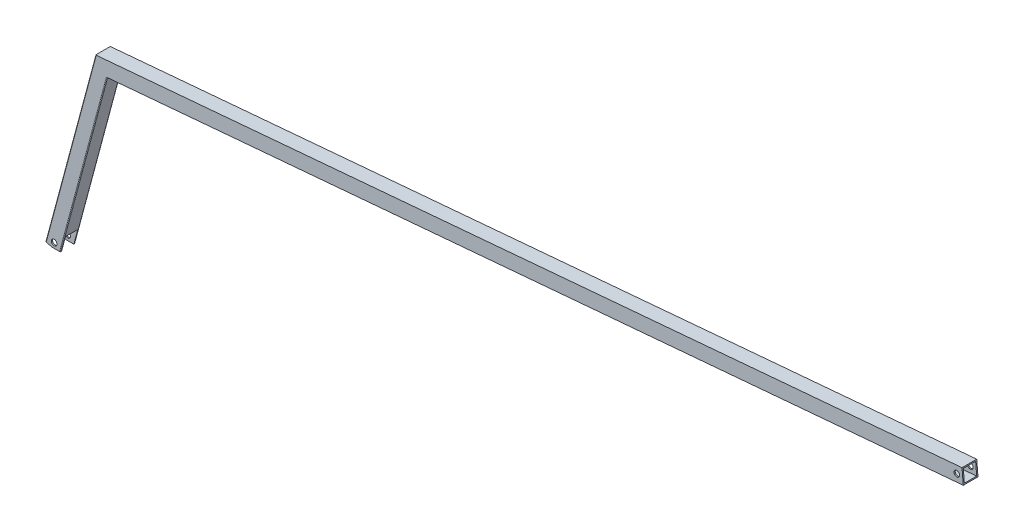
ISO-10303-21;
HEADER;
FILE_DESCRIPTION(('STEP AP214'),'2;1');
FILE_NAME('part.step','',(''),(''),'','','');
FILE_SCHEMA(('AUTOMOTIVE_DESIGN { 1 0 10303 214 1 1 1 1 }'));
ENDSEC;
DATA;
#1=APPLICATION_CONTEXT('core data for automotive mechanical design processes');
#2=APPLICATION_PROTOCOL_DEFINITION('international standard','automotive_design',2000,#1);
#3=PRODUCT_CONTEXT('',#1,'mechanical');
#4=PRODUCT('Part','Part','',(#3));
#5=PRODUCT_RELATED_PRODUCT_CATEGORY('part','',(#4));
#6=PRODUCT_DEFINITION_FORMATION('','',#4);
#7=PRODUCT_DEFINITION_CONTEXT('part definition',#1,'design');
#8=PRODUCT_DEFINITION('design','',#6,#7);
#9=PRODUCT_DEFINITION_SHAPE('','',#8);
#10=(LENGTH_UNIT() NAMED_UNIT(*) SI_UNIT(.MILLI.,.METRE.));
#11=(NAMED_UNIT(*) PLANE_ANGLE_UNIT() SI_UNIT($,.RADIAN.));
#12=(NAMED_UNIT(*) SI_UNIT($,.STERADIAN.) SOLID_ANGLE_UNIT());
#13=UNCERTAINTY_MEASURE_WITH_UNIT(LENGTH_MEASURE(1.E-05),#10,'distance_accuracy_value','');
#14=(GEOMETRIC_REPRESENTATION_CONTEXT(3) GLOBAL_UNCERTAINTY_ASSIGNED_CONTEXT((#13)) GLOBAL_UNIT_ASSIGNED_CONTEXT((#10,
#11,#12)) REPRESENTATION_CONTEXT('',''));
#15=CARTESIAN_POINT('',(0.,0.,0.));
#16=DIRECTION('',(0.,0.,1.));
#17=DIRECTION('',(1.,0.,0.));
#18=AXIS2_PLACEMENT_3D('',#15,#16,#17);
#19=CARTESIAN_POINT('',(-1615.56750939847,-563.646200742588,-12.7));
#20=DIRECTION('',(-0.258819045102523,-0.965925826289068,0.));
#21=DIRECTION('',(0.965925826289068,-0.258819045102523,0.));
#22=AXIS2_PLACEMENT_3D('',#19,#20,#21);
#23=PLANE('',#22);
#24=DIRECTION('',(0.965925826289068,-0.258819045102523,0.));
#25=VECTOR('',#24,1.);
#26=CARTESIAN_POINT('',(-249.13405255097,-929.780942015746,-10.6426));
#27=LINE('',#26,#25);
#28=CARTESIAN_POINT('',(-1615.56750939847,-563.646200742588,-10.6426));
#29=VERTEX_POINT('',#28);
#30=CARTESIAN_POINT('',(-1604.45884230232,-566.622759119988,-10.6426));
#31=VERTEX_POINT('',#30);
#32=EDGE_CURVE('E470',#29,#31,#27,.T.);
#33=ORIENTED_EDGE('',*,*,#32,.F.);
#34=DIRECTION('',(0.,0.,1.));
#35=VECTOR('',#34,1.);
#36=CARTESIAN_POINT('',(-1615.56750939847,-563.646200742588,-12.7));
#37=LINE('',#36,#35);
#38=CARTESIAN_POINT('',(-1615.56750939847,-563.646200742588,-11.43));
#39=VERTEX_POINT('',#38);
#40=EDGE_CURVE('E297',#39,#29,#37,.T.);
#41=ORIENTED_EDGE('',*,*,#40,.F.);
#42=CARTESIAN_POINT('',(-1614.34078359909,-563.974900929868,-11.43));
#43=DIRECTION('',(-0.258819045102523,-0.965925826289068,0.));
#44=DIRECTION('',(0.965925826289068,-0.258819045102523,0.));
#45=AXIS2_PLACEMENT_3D('',#42,#43,#44);
#46=CIRCLE('',#45,1.27);
#47=CARTESIAN_POINT('',(-1614.34078359909,-563.974900929868,-12.7));
#48=VERTEX_POINT('',#47);
#49=EDGE_CURVE('E345',#39,#48,#46,.T.);
#50=ORIENTED_EDGE('',*,*,#49,.T.);
#51=DIRECTION('',(0.965925826289068,-0.258819045102523,0.));
#52=VECTOR('',#51,1.);
#53=CARTESIAN_POINT('',(-1615.56750939847,-563.646200742588,-12.7));
#54=LINE('',#53,#52);
#55=CARTESIAN_POINT('',(-1604.45884230232,-566.622759119988,-12.7));
#56=VERTEX_POINT('',#55);
#57=EDGE_CURVE('E514',#48,#56,#54,.T.);
#58=ORIENTED_EDGE('',*,*,#57,.T.);
#59=DIRECTION('',(0.,0.,-1.));
#60=VECTOR('',#59,1.);
#61=CARTESIAN_POINT('',(-1604.45884230232,-566.622759119988,12.7));
#62=LINE('',#61,#60);
#63=EDGE_CURVE('E450',#31,#56,#62,.T.);
#64=ORIENTED_EDGE('',*,*,#63,.F.);
#65=EDGE_LOOP('',(#33,#41,#50,#58,#64));
#66=FACE_BOUND('',#65,.T.);
#67=ADVANCED_FACE('F83',(#66),#23,.T.);
#68=CARTESIAN_POINT('',(-1604.45884230232,-566.622759119988,12.7));
#69=DIRECTION('',(0.,1.,0.));
#70=DIRECTION('',(0.,0.,1.));
#71=AXIS2_PLACEMENT_3D('',#68,#69,#70);
#72=PLANE('',#71);
#73=DIRECTION('',(0.,0.,-1.));
#74=VECTOR('',#73,1.);
#75=CARTESIAN_POINT('',(-1590.06906082951,-566.622759119988,12.7));
#76=LINE('',#75,#74);
#77=CARTESIAN_POINT('',(-1590.06906082951,-566.622759119987,-10.6426));
#78=VERTEX_POINT('',#77);
#79=CARTESIAN_POINT('',(-1590.06906082951,-566.622759119988,-11.43));
#80=VERTEX_POINT('',#79);
#81=EDGE_CURVE('E455',#78,#80,#76,.T.);
#82=ORIENTED_EDGE('',*,*,#81,.F.);
#83=DIRECTION('',(-1.,0.,0.));
#84=VECTOR('',#83,1.);
#85=CARTESIAN_POINT('',(0.,-566.622759119988,-10.6426));
#86=LINE('',#85,#84);
#87=EDGE_CURVE('E460',#78,#31,#86,.T.);
#88=ORIENTED_EDGE('',*,*,#87,.T.);
#89=ORIENTED_EDGE('',*,*,#63,.T.);
#90=DIRECTION('',(1.,0.,0.));
#91=VECTOR('',#90,1.);
#92=CARTESIAN_POINT('',(-1604.45884230232,-566.622759119988,-12.7));
#93=LINE('',#92,#91);
#94=CARTESIAN_POINT('',(-1591.38386157863,-566.622759119988,-12.7));
#95=VERTEX_POINT('',#94);
#96=EDGE_CURVE('E446',#56,#95,#93,.T.);
#97=ORIENTED_EDGE('',*,*,#96,.T.);
#98=CARTESIAN_POINT('',(-1591.38386157863,-566.622759119988,-11.43));
#99=DIRECTION('',(0.,1.,0.));
#100=DIRECTION('',(-1.,0.,0.));
#101=AXIS2_PLACEMENT_3D('',#98,#99,#100);
#102=ELLIPSE('',#101,1.31480074912081,1.27);
#103=EDGE_CURVE('E372',#95,#80,#102,.F.);
#104=ORIENTED_EDGE('',*,*,#103,.T.);
#105=EDGE_LOOP('',(#82,#88,#89,#97,#104));
#106=FACE_BOUND('',#105,.T.);
#107=ADVANCED_FACE('F600',(#106),#72,.F.);
#108=CARTESIAN_POINT('',(-1615.56750939847,-563.646200742588,10.6426));
#109=VERTEX_POINT('',#108);
#110=CARTESIAN_POINT('',(-1615.56750939847,-563.646200742588,11.43));
#111=VERTEX_POINT('',#110);
#112=EDGE_CURVE('E286',#109,#111,#37,.T.);
#113=ORIENTED_EDGE('',*,*,#112,.F.);
#114=DIRECTION('',(0.965925826289068,-0.258819045102523,0.));
#115=VECTOR('',#114,1.);
#116=CARTESIAN_POINT('',(-249.13405255097,-929.780942015746,10.6426));
#117=LINE('',#116,#115);
#118=CARTESIAN_POINT('',(-1604.45884230232,-566.622759119988,10.6426));
#119=VERTEX_POINT('',#118);
#120=EDGE_CURVE('E268',#109,#119,#117,.T.);
#121=ORIENTED_EDGE('',*,*,#120,.T.);
#122=CARTESIAN_POINT('',(-1604.45884230232,-566.622759119988,12.7));
#123=VERTEX_POINT('',#122);
#124=EDGE_CURVE('E456',#123,#119,#62,.T.);
#125=ORIENTED_EDGE('',*,*,#124,.F.);
#126=DIRECTION('',(0.965925826289068,-0.258819045102523,0.));
#127=VECTOR('',#126,1.);
#128=CARTESIAN_POINT('',(-1615.56750939847,-563.646200742588,12.7));
#129=LINE('',#128,#127);
#130=CARTESIAN_POINT('',(-1614.34078359909,-563.974900929868,12.7));
#131=VERTEX_POINT('',#130);
#132=EDGE_CURVE('E511',#131,#123,#129,.T.);
#133=ORIENTED_EDGE('',*,*,#132,.F.);
#134=CARTESIAN_POINT('',(-1614.34078359909,-563.974900929868,11.43));
#135=DIRECTION('',(-0.258819045102523,-0.965925826289068,0.));
#136=DIRECTION('',(0.965925826289068,-0.258819045102523,0.));
#137=AXIS2_PLACEMENT_3D('',#134,#135,#136);
#138=CIRCLE('',#137,1.27);
#139=EDGE_CURVE('E295',#131,#111,#138,.T.);
#140=ORIENTED_EDGE('',*,*,#139,.T.);
#141=EDGE_LOOP('',(#113,#121,#125,#133,#140));
#142=FACE_BOUND('',#141,.T.);
#143=ADVANCED_FACE('F293',(#142),#23,.T.);
#144=CARTESIAN_POINT('',(-30.6817839344926,-135.845170319449,-12.7));
#145=DIRECTION('',(0.996194698091746,0.0871557427476583,0.));
#146=DIRECTION('',(-0.0871557427476583,0.996194698091746,0.));
#147=AXIS2_PLACEMENT_3D('',#144,#145,#146);
#148=PLANE('',#147);
#149=DIRECTION('',(-0.0871557427476583,0.996194698091746,0.));
#150=VECTOR('',#149,1.);
#151=CARTESIAN_POINT('',(-30.6817839344926,-135.845170319449,12.7));
#152=LINE('',#151,#150);
#153=CARTESIAN_POINT('',(-30.6817839344926,-135.845170319449,12.7));
#154=VERTEX_POINT('',#153);
#155=CARTESIAN_POINT('',(-32.8955398002831,-110.541824987919,12.7));
#156=VERTEX_POINT('',#155);
#157=EDGE_CURVE('E529',#154,#156,#152,.T.);
#158=ORIENTED_EDGE('',*,*,#157,.F.);
#159=DIRECTION('',(0.,0.,1.));
#160=VECTOR('',#159,1.);
#161=CARTESIAN_POINT('',(-30.6817839344926,-135.845170319449,-12.7));
#162=LINE('',#161,#160);
#163=CARTESIAN_POINT('',(-30.6817839344926,-135.845170319449,-12.7));
#164=VERTEX_POINT('',#163);
#165=EDGE_CURVE('E310',#164,#154,#162,.T.);
#166=ORIENTED_EDGE('',*,*,#165,.F.);
#167=DIRECTION('',(-0.0871557427476583,0.996194698091746,0.));
#168=VECTOR('',#167,1.);
#169=CARTESIAN_POINT('',(-30.6817839344926,-135.845170319449,-12.7));
#170=LINE('',#169,#168);
#171=CARTESIAN_POINT('',(-32.8955398002831,-110.541824987919,-12.7));
#172=VERTEX_POINT('',#171);
#173=EDGE_CURVE('E520',#164,#172,#170,.T.);
#174=ORIENTED_EDGE('',*,*,#173,.T.);
#175=DIRECTION('',(0.,0.,1.));
#176=VECTOR('',#175,1.);
#177=CARTESIAN_POINT('',(-32.8955398002831,-110.541824987919,-12.7));
#178=LINE('',#177,#176);
#179=EDGE_CURVE('E303',#172,#156,#178,.T.);
#180=ORIENTED_EDGE('',*,*,#179,.T.);
#181=EDGE_LOOP('',(#158,#166,#174,#180));
#182=FACE_BOUND('',#181,.T.);
#183=DIRECTION('',(0.,0.,1.));
#184=VECTOR('',#183,1.);
#185=CARTESIAN_POINT('',(-30.8610981596216,-133.795599347595,-12.7));
#186=LINE('',#185,#184);
#187=CARTESIAN_POINT('',(-30.8610981596216,-133.795599347595,-10.6426));
#188=VERTEX_POINT('',#187);
#189=CARTESIAN_POINT('',(-30.8610981596216,-133.795599347595,10.6426));
#190=VERTEX_POINT('',#189);
#191=EDGE_CURVE('E483',#188,#190,#186,.T.);
#192=ORIENTED_EDGE('',*,*,#191,.T.);
#193=DIRECTION('',(-0.0871557427476583,0.996194698091746,0.));
#194=VECTOR('',#193,1.);
#195=CARTESIAN_POINT('',(-42.2433544501262,-3.69581462369344,10.6426));
#196=LINE('',#195,#194);
#197=CARTESIAN_POINT('',(-32.7162255751541,-112.591395959773,10.6426));
#198=VERTEX_POINT('',#197);
#199=EDGE_CURVE('E478',#190,#198,#196,.T.);
#200=ORIENTED_EDGE('',*,*,#199,.T.);
#201=DIRECTION('',(0.,0.,1.));
#202=VECTOR('',#201,1.);
#203=CARTESIAN_POINT('',(-32.7162255751541,-112.591395959773,-12.7));
#204=LINE('',#203,#202);
#205=CARTESIAN_POINT('',(-32.7162255751541,-112.591395959773,-10.6426));
#206=VERTEX_POINT('',#205);
#207=EDGE_CURVE('E475',#206,#198,#204,.T.);
#208=ORIENTED_EDGE('',*,*,#207,.F.);
#209=DIRECTION('',(-0.0871557427476583,0.996194698091746,0.));
#210=VECTOR('',#209,1.);
#211=CARTESIAN_POINT('',(-42.2433544501262,-3.69581462369344,-10.6426));
#212=LINE('',#211,#210);
#213=EDGE_CURVE('E466',#188,#206,#212,.T.);
#214=ORIENTED_EDGE('',*,*,#213,.F.);
#215=EDGE_LOOP('',(#192,#200,#208,#214));
#216=FACE_BOUND('',#215,.T.);
#217=ADVANCED_FACE('F584',(#182,#216),#148,.T.);
#218=CARTESIAN_POINT('',(-1600.835,-557.732759119986,-12.7));
#219=DIRECTION('',(0.,0.,1.));
#220=DIRECTION('',(1.,0.,0.));
#221=AXIS2_PLACEMENT_3D('',#218,#219,#220);
#222=CYLINDRICAL_SURFACE('',#221,4.826);
#223=CARTESIAN_POINT('',(-1600.835,-557.732759119986,12.7));
#224=DIRECTION('',(0.,0.,-1.));
#225=DIRECTION('',(-1.,0.,0.));
#226=AXIS2_PLACEMENT_3D('',#223,#224,#225);
#227=CIRCLE('',#226,4.826);
#228=CARTESIAN_POINT('',(-1605.661,-557.732759119986,12.7));
#229=VERTEX_POINT('',#228);
#230=EDGE_CURVE('E505',#229,#229,#227,.T.);
#231=ORIENTED_EDGE('',*,*,#230,.F.);
#232=EDGE_LOOP('',(#231));
#233=FACE_BOUND('',#232,.T.);
#234=CARTESIAN_POINT('',(-1600.835,-557.732759119986,10.6426));
#235=DIRECTION('',(0.,0.,1.));
#236=DIRECTION('',(1.,0.,0.));
#237=AXIS2_PLACEMENT_3D('',#234,#235,#236);
#238=CIRCLE('',#237,4.826);
#239=CARTESIAN_POINT('',(-1596.009,-557.732759119986,10.6426));
#240=VERTEX_POINT('',#239);
#241=EDGE_CURVE('E494',#240,#240,#238,.F.);
#242=ORIENTED_EDGE('',*,*,#241,.T.);
#243=EDGE_LOOP('',(#242));
#244=FACE_BOUND('',#243,.T.);
#245=ADVANCED_FACE('F615',(#233,#244),#222,.F.);
#246=CARTESIAN_POINT('',(-41.91,-124.079,-12.7));
#247=DIRECTION('',(0.,0.,1.));
#248=DIRECTION('',(1.,0.,0.));
#249=AXIS2_PLACEMENT_3D('',#246,#247,#248);
#250=CYLINDRICAL_SURFACE('',#249,4.82599999999999);
#251=CARTESIAN_POINT('',(-41.91,-124.079,12.7));
#252=DIRECTION('',(0.,0.,-1.));
#253=DIRECTION('',(-1.,0.,0.));
#254=AXIS2_PLACEMENT_3D('',#251,#252,#253);
#255=CIRCLE('',#254,4.82599999999999);
#256=CARTESIAN_POINT('',(-46.736,-124.079,12.7));
#257=VERTEX_POINT('',#256);
#258=EDGE_CURVE('E474',#257,#257,#255,.T.);
#259=ORIENTED_EDGE('',*,*,#258,.F.);
#260=EDGE_LOOP('',(#259));
#261=FACE_BOUND('',#260,.T.);
#262=CARTESIAN_POINT('',(-41.91,-124.079,10.6426));
#263=DIRECTION('',(0.,0.,1.));
#264=DIRECTION('',(1.,0.,0.));
#265=AXIS2_PLACEMENT_3D('',#262,#263,#264);
#266=CIRCLE('',#265,4.82599999999999);
#267=CARTESIAN_POINT('',(-37.084,-124.079,10.6426));
#268=VERTEX_POINT('',#267);
#269=EDGE_CURVE('E462',#268,#268,#266,.F.);
#270=ORIENTED_EDGE('',*,*,#269,.T.);
#271=EDGE_LOOP('',(#270));
#272=FACE_BOUND('',#271,.T.);
#273=ADVANCED_FACE('F621',(#261,#272),#250,.F.);
#274=CARTESIAN_POINT('',(0.,0.,-12.7));
#275=DIRECTION('',(0.,0.,1.));
#276=DIRECTION('',(1.,0.,0.));
#277=AXIS2_PLACEMENT_3D('',#274,#275,#276);
#278=PLANE('',#277);
#279=DIRECTION('',(0.258819045102523,0.965925826289068,0.));
#280=VECTOR('',#279,1.);
#281=CARTESIAN_POINT('',(-1592.25971921012,-569.891504300911,-12.7));
#282=LINE('',#281,#280);
#283=CARTESIAN_POINT('',(-1510.65157104923,-265.325749052864,-12.7));
#284=VERTEX_POINT('',#283);
#285=EDGE_CURVE('E357',#284,#95,#282,.F.);
#286=ORIENTED_EDGE('',*,*,#285,.T.);
#287=ORIENTED_EDGE('',*,*,#96,.F.);
#288=ORIENTED_EDGE('',*,*,#57,.F.);
#289=DIRECTION('',(-0.258819045102522,-0.965925826289068,0.));
#290=VECTOR('',#289,1.);
#291=CARTESIAN_POINT('',(-1528.00983137514,-241.783400964293,-12.7));
#292=LINE('',#291,#290);
#293=CARTESIAN_POINT('',(-1527.89019429097,-241.33690928771,-12.7));
#294=VERTEX_POINT('',#293);
#295=EDGE_CURVE('E360',#48,#294,#292,.F.);
#296=ORIENTED_EDGE('',*,*,#295,.T.);
#297=DIRECTION('',(-0.996194698091745,-0.0871557427476583,0.));
#298=VECTOR('',#297,1.);
#299=CARTESIAN_POINT('',(-32.8955398002831,-110.541824987919,-12.7));
#300=LINE('',#299,#298);
#301=EDGE_CURVE('E315',#172,#294,#300,.T.);
#302=ORIENTED_EDGE('',*,*,#301,.F.);
#303=ORIENTED_EDGE('',*,*,#173,.F.);
#304=DIRECTION('',(0.996194698091746,0.0871557427476584,0.));
#305=VECTOR('',#304,1.);
#306=CARTESIAN_POINT('',(-1509.30520816567,-265.207957563561,-12.7));
#307=LINE('',#306,#305);
#308=EDGE_CURVE('E517',#284,#164,#307,.T.);
#309=ORIENTED_EDGE('',*,*,#308,.F.);
#310=EDGE_LOOP('',(#286,#287,#288,#296,#302,#303,#309));
#311=FACE_BOUND('',#310,.T.);
#312=CARTESIAN_POINT('',(-1600.835,-557.732759119986,-12.7));
#313=DIRECTION('',(0.,0.,-1.));
#314=DIRECTION('',(-1.,0.,0.));
#315=AXIS2_PLACEMENT_3D('',#312,#313,#314);
#316=CIRCLE('',#315,4.826);
#317=CARTESIAN_POINT('',(-1605.661,-557.732759119986,-12.7));
#318=VERTEX_POINT('',#317);
#319=EDGE_CURVE('E508',#318,#318,#316,.T.);
#320=ORIENTED_EDGE('',*,*,#319,.F.);
#321=EDGE_LOOP('',(#320));
#322=FACE_BOUND('',#321,.T.);
#323=CARTESIAN_POINT('',(-41.91,-124.079,-12.7));
#324=DIRECTION('',(0.,0.,-1.));
#325=DIRECTION('',(-1.,0.,0.));
#326=AXIS2_PLACEMENT_3D('',#323,#324,#325);
#327=CIRCLE('',#326,4.82599999999999);
#328=CARTESIAN_POINT('',(-46.736,-124.079,-12.7));
#329=VERTEX_POINT('',#328);
#330=EDGE_CURVE('E502',#329,#329,#327,.T.);
#331=ORIENTED_EDGE('',*,*,#330,.F.);
#332=EDGE_LOOP('',(#331));
#333=FACE_BOUND('',#332,.T.);
#334=ADVANCED_FACE('F649',(#311,#322,#333),#278,.F.);
#335=CARTESIAN_POINT('',(0.,0.,12.7));
#336=DIRECTION('',(0.,0.,1.));
#337=DIRECTION('',(1.,0.,0.));
#338=AXIS2_PLACEMENT_3D('',#335,#336,#337);
#339=PLANE('',#338);
#340=DIRECTION('',(1.,0.,0.));
#341=VECTOR('',#340,1.);
#342=CARTESIAN_POINT('',(-1604.45884230232,-566.622759119988,12.7));
#343=LINE('',#342,#341);
#344=CARTESIAN_POINT('',(-1591.38386157863,-566.622759119988,12.7));
#345=VERTEX_POINT('',#344);
#346=EDGE_CURVE('E447',#123,#345,#343,.T.);
#347=ORIENTED_EDGE('',*,*,#346,.T.);
#348=DIRECTION('',(0.258819045102523,0.965925826289068,0.));
#349=VECTOR('',#348,1.);
#350=CARTESIAN_POINT('',(-1343.12566665915,359.889437714835,12.7));
#351=LINE('',#350,#349);
#352=CARTESIAN_POINT('',(-1510.65157104923,-265.325749052864,12.7));
#353=VERTEX_POINT('',#352);
#354=EDGE_CURVE('E338',#345,#353,#351,.T.);
#355=ORIENTED_EDGE('',*,*,#354,.T.);
#356=DIRECTION('',(0.996194698091746,0.0871557427476584,0.));
#357=VECTOR('',#356,1.);
#358=CARTESIAN_POINT('',(-1509.30520816567,-265.207957563561,12.7));
#359=LINE('',#358,#357);
#360=EDGE_CURVE('E527',#353,#154,#359,.T.);
#361=ORIENTED_EDGE('',*,*,#360,.T.);
#362=ORIENTED_EDGE('',*,*,#157,.T.);
#363=DIRECTION('',(-0.996194698091745,-0.0871557427476583,0.));
#364=VECTOR('',#363,1.);
#365=CARTESIAN_POINT('',(-32.8955398002831,-110.541824987919,12.7));
#366=LINE('',#365,#364);
#367=CARTESIAN_POINT('',(-1527.89019429097,-241.33690928771,12.7));
#368=VERTEX_POINT('',#367);
#369=EDGE_CURVE('E306',#156,#368,#366,.T.);
#370=ORIENTED_EDGE('',*,*,#369,.T.);
#371=DIRECTION('',(-0.258819045102522,-0.965925826289068,0.));
#372=VECTOR('',#371,1.);
#373=CARTESIAN_POINT('',(-1365.20673104812,365.806041085877,12.7));
#374=LINE('',#373,#372);
#375=EDGE_CURVE('E335',#368,#131,#374,.T.);
#376=ORIENTED_EDGE('',*,*,#375,.T.);
#377=ORIENTED_EDGE('',*,*,#132,.T.);
#378=EDGE_LOOP('',(#347,#355,#361,#362,#370,#376,#377));
#379=FACE_BOUND('',#378,.T.);
#380=ORIENTED_EDGE('',*,*,#230,.T.);
#381=EDGE_LOOP('',(#380));
#382=FACE_BOUND('',#381,.T.);
#383=ORIENTED_EDGE('',*,*,#258,.T.);
#384=EDGE_LOOP('',(#383));
#385=FACE_BOUND('',#384,.T.);
#386=ADVANCED_FACE('F536',(#379,#382,#385),#339,.T.);
#387=CARTESIAN_POINT('',(-1529.23655717452,-241.454700777013,-12.7));
#388=DIRECTION('',(-0.965925826289068,0.258819045102522,0.));
#389=DIRECTION('',(-0.258819045102522,-0.965925826289068,0.));
#390=AXIS2_PLACEMENT_3D('',#387,#388,#389);
#391=PLANE('',#390);
#392=DIRECTION('',(-0.258819045102522,-0.965925826289068,0.));
#393=VECTOR('',#392,1.);
#394=CARTESIAN_POINT('',(-1529.23655717452,-241.454700777013,-10.6426));
#395=LINE('',#394,#393);
#396=CARTESIAN_POINT('',(-1609.89946179856,-542.492759119987,-10.6426));
#397=VERTEX_POINT('',#396);
#398=EDGE_CURVE('E436',#397,#29,#395,.T.);
#399=ORIENTED_EDGE('',*,*,#398,.F.);
#400=CARTESIAN_POINT('',(-1609.89946179856,-542.492759119987,-9.37260000000003));
#401=DIRECTION('',(-0.965925826289068,0.258819045102522,0.));
#402=DIRECTION('',(0.258819045102522,0.965925826289068,0.));
#403=AXIS2_PLACEMENT_3D('',#400,#401,#402);
#404=ELLIPSE('',#403,1.31480074912081,1.27);
#405=CARTESIAN_POINT('',(-1609.55916632417,-541.222759119987,-9.37260000000003));
#406=VERTEX_POINT('',#405);
#407=EDGE_CURVE('E397',#397,#406,#404,.F.);
#408=ORIENTED_EDGE('',*,*,#407,.T.);
#409=DIRECTION('',(0.,0.,-1.));
#410=VECTOR('',#409,1.);
#411=CARTESIAN_POINT('',(-1609.55916632417,-541.222759119987,-12.7));
#412=LINE('',#411,#410);
#413=CARTESIAN_POINT('',(-1609.55916632417,-541.222759119987,9.37259999999997));
#414=VERTEX_POINT('',#413);
#415=EDGE_CURVE('E421',#414,#406,#412,.T.);
#416=ORIENTED_EDGE('',*,*,#415,.F.);
#417=CARTESIAN_POINT('',(-1609.89946179856,-542.492759119987,9.37259999999997));
#418=DIRECTION('',(-0.965925826289068,0.258819045102522,0.));
#419=DIRECTION('',(-0.258819045102522,-0.965925826289068,0.));
#420=AXIS2_PLACEMENT_3D('',#417,#418,#419);
#421=ELLIPSE('',#420,1.31480074912081,1.27);
#422=CARTESIAN_POINT('',(-1609.89946179856,-542.492759119987,10.6426));
#423=VERTEX_POINT('',#422);
#424=EDGE_CURVE('E290',#414,#423,#421,.F.);
#425=ORIENTED_EDGE('',*,*,#424,.T.);
#426=DIRECTION('',(0.258819045102522,0.965925826289068,0.));
#427=VECTOR('',#426,1.);
#428=CARTESIAN_POINT('',(-1529.23655717452,-241.454700777013,10.6426));
#429=LINE('',#428,#427);
#430=EDGE_CURVE('E273',#109,#423,#429,.T.);
#431=ORIENTED_EDGE('',*,*,#430,.F.);
#432=ORIENTED_EDGE('',*,*,#112,.T.);
#433=DIRECTION('',(-0.258819045102522,-0.965925826289068,0.));
#434=VECTOR('',#433,1.);
#435=CARTESIAN_POINT('',(-1529.23655717452,-241.454700777013,11.43));
#436=LINE('',#435,#434);
#437=CARTESIAN_POINT('',(-1529.23655717452,-241.454700777013,11.43));
#438=VERTEX_POINT('',#437);
#439=EDGE_CURVE('E351',#111,#438,#436,.F.);
#440=ORIENTED_EDGE('',*,*,#439,.T.);
#441=DIRECTION('',(0.,0.,1.));
#442=VECTOR('',#441,1.);
#443=CARTESIAN_POINT('',(-1529.23655717452,-241.454700777013,-12.7));
#444=LINE('',#443,#442);
#445=CARTESIAN_POINT('',(-1529.23655717452,-241.454700777013,-11.43));
#446=VERTEX_POINT('',#445);
#447=EDGE_CURVE('E298',#446,#438,#444,.T.);
#448=ORIENTED_EDGE('',*,*,#447,.F.);
#449=DIRECTION('',(-0.258819045102522,-0.965925826289068,0.));
#450=VECTOR('',#449,1.);
#451=CARTESIAN_POINT('',(-1615.56750939847,-563.646200742588,-11.43));
#452=LINE('',#451,#450);
#453=EDGE_CURVE('E348',#446,#39,#452,.T.);
#454=ORIENTED_EDGE('',*,*,#453,.T.);
#455=ORIENTED_EDGE('',*,*,#40,.T.);
#456=EDGE_LOOP('',(#399,#408,#416,#425,#431,#432,#440,#448,#454,#455));
#457=FACE_BOUND('',#456,.T.);
#458=ADVANCED_FACE('F285',(#457),#391,.T.);
#459=CARTESIAN_POINT('',(-32.8955398002831,-110.541824987919,-12.7));
#460=DIRECTION('',(-0.0871557427476584,0.996194698091746,0.));
#461=DIRECTION('',(-0.996194698091746,-0.0871557427476584,0.));
#462=AXIS2_PLACEMENT_3D('',#459,#460,#461);
#463=PLANE('',#462);
#464=ORIENTED_EDGE('',*,*,#447,.T.);
#465=CARTESIAN_POINT('',(-1527.89019429097,-241.33690928771,11.43));
#466=DIRECTION('',(-0.0871557427476584,0.996194698091746,0.));
#467=DIRECTION('',(-0.996194698091746,-0.0871557427476584,0.));
#468=AXIS2_PLACEMENT_3D('',#465,#466,#467);
#469=ELLIPSE('',#468,1.35150577104441,1.27);
#470=EDGE_CURVE('E355',#438,#368,#469,.T.);
#471=ORIENTED_EDGE('',*,*,#470,.T.);
#472=ORIENTED_EDGE('',*,*,#369,.F.);
#473=ORIENTED_EDGE('',*,*,#179,.F.);
#474=ORIENTED_EDGE('',*,*,#301,.T.);
#475=CARTESIAN_POINT('',(-1527.89019429097,-241.33690928771,-11.43));
#476=DIRECTION('',(-0.0871557427476584,0.996194698091746,0.));
#477=DIRECTION('',(0.996194698091746,0.0871557427476584,0.));
#478=AXIS2_PLACEMENT_3D('',#475,#476,#477);
#479=ELLIPSE('',#478,1.35150577104441,1.27);
#480=EDGE_CURVE('E353',#294,#446,#479,.T.);
#481=ORIENTED_EDGE('',*,*,#480,.T.);
#482=EDGE_LOOP('',(#464,#471,#472,#473,#474,#481));
#483=FACE_BOUND('',#482,.T.);
#484=ADVANCED_FACE('F544',(#483),#463,.T.);
#485=CARTESIAN_POINT('',(-1509.30520816567,-265.207957563561,-12.7));
#486=DIRECTION('',(0.0871557427476584,-0.996194698091746,0.));
#487=DIRECTION('',(0.996194698091746,0.0871557427476584,0.));
#488=AXIS2_PLACEMENT_3D('',#485,#486,#487);
#489=PLANE('',#488);
#490=ORIENTED_EDGE('',*,*,#360,.F.);
#491=CARTESIAN_POINT('',(-1510.65157104923,-265.325749052864,11.43));
#492=DIRECTION('',(0.0871557427476584,-0.996194698091746,0.));
#493=DIRECTION('',(0.996194698091746,0.0871557427476584,0.));
#494=AXIS2_PLACEMENT_3D('',#491,#492,#493);
#495=ELLIPSE('',#494,1.35150577104441,1.27);
#496=CARTESIAN_POINT('',(-1509.30520816567,-265.207957563561,11.43));
#497=VERTEX_POINT('',#496);
#498=EDGE_CURVE('E367',#353,#497,#495,.F.);
#499=ORIENTED_EDGE('',*,*,#498,.T.);
#500=DIRECTION('',(0.,0.,1.));
#501=VECTOR('',#500,1.);
#502=CARTESIAN_POINT('',(-1509.30520816567,-265.207957563561,-12.7));
#503=LINE('',#502,#501);
#504=CARTESIAN_POINT('',(-1509.30520816567,-265.207957563561,-11.43));
#505=VERTEX_POINT('',#504);
#506=EDGE_CURVE('E312',#505,#497,#503,.T.);
#507=ORIENTED_EDGE('',*,*,#506,.F.);
#508=CARTESIAN_POINT('',(-1510.65157104923,-265.325749052864,-11.43));
#509=DIRECTION('',(0.0871557427476584,-0.996194698091746,0.));
#510=DIRECTION('',(-0.996194698091746,-0.0871557427476584,0.));
#511=AXIS2_PLACEMENT_3D('',#508,#509,#510);
#512=ELLIPSE('',#511,1.35150577104441,1.27);
#513=EDGE_CURVE('E369',#505,#284,#512,.F.);
#514=ORIENTED_EDGE('',*,*,#513,.T.);
#515=ORIENTED_EDGE('',*,*,#308,.T.);
#516=ORIENTED_EDGE('',*,*,#165,.T.);
#517=EDGE_LOOP('',(#490,#499,#507,#514,#515,#516));
#518=FACE_BOUND('',#517,.T.);
#519=ADVANCED_FACE('F628',(#518),#489,.T.);
#520=CARTESIAN_POINT('',(-1591.03299341073,-570.220204488192,-12.7));
#521=DIRECTION('',(0.965925826289068,-0.258819045102523,0.));
#522=DIRECTION('',(0.258819045102523,0.965925826289068,0.));
#523=AXIS2_PLACEMENT_3D('',#520,#521,#522);
#524=PLANE('',#523);
#525=DIRECTION('',(0.258819045102523,0.965925826289068,0.));
#526=VECTOR('',#525,1.);
#527=CARTESIAN_POINT('',(-1591.03299341073,-570.220204488192,-10.6426));
#528=LINE('',#527,#526);
#529=CARTESIAN_POINT('',(-1583.60344681614,-542.492759119987,-10.6426));
#530=VERTEX_POINT('',#529);
#531=EDGE_CURVE('E440',#78,#530,#528,.T.);
#532=ORIENTED_EDGE('',*,*,#531,.F.);
#533=ORIENTED_EDGE('',*,*,#81,.T.);
#534=DIRECTION('',(0.258819045102523,0.965925826289068,0.));
#535=VECTOR('',#534,1.);
#536=CARTESIAN_POINT('',(-1509.30520816567,-265.207957563561,-11.43));
#537=LINE('',#536,#535);
#538=EDGE_CURVE('E340',#80,#505,#537,.T.);
#539=ORIENTED_EDGE('',*,*,#538,.T.);
#540=ORIENTED_EDGE('',*,*,#506,.T.);
#541=DIRECTION('',(0.258819045102523,0.965925826289068,0.));
#542=VECTOR('',#541,1.);
#543=CARTESIAN_POINT('',(-1591.03299341073,-570.220204488192,11.43));
#544=LINE('',#543,#542);
#545=CARTESIAN_POINT('',(-1590.06906082951,-566.622759119988,11.43));
#546=VERTEX_POINT('',#545);
#547=EDGE_CURVE('E342',#497,#546,#544,.F.);
#548=ORIENTED_EDGE('',*,*,#547,.T.);
#549=CARTESIAN_POINT('',(-1590.06906082951,-566.622759119988,10.6426));
#550=VERTEX_POINT('',#549);
#551=EDGE_CURVE('E452',#546,#550,#76,.T.);
#552=ORIENTED_EDGE('',*,*,#551,.T.);
#553=DIRECTION('',(-0.258819045102523,-0.965925826289068,0.));
#554=VECTOR('',#553,1.);
#555=CARTESIAN_POINT('',(-1591.03299341073,-570.220204488192,10.6426));
#556=LINE('',#555,#554);
#557=CARTESIAN_POINT('',(-1583.60344681614,-542.492759119987,10.6426));
#558=VERTEX_POINT('',#557);
#559=EDGE_CURVE('E291',#558,#550,#556,.T.);
#560=ORIENTED_EDGE('',*,*,#559,.F.);
#561=CARTESIAN_POINT('',(-1583.60344681614,-542.492759119987,9.37259999999997));
#562=DIRECTION('',(0.965925826289068,-0.258819045102523,0.));
#563=DIRECTION('',(-0.258819045102523,-0.965925826289068,0.));
#564=AXIS2_PLACEMENT_3D('',#561,#562,#563);
#565=ELLIPSE('',#564,1.31480074912081,1.27);
#566=CARTESIAN_POINT('',(-1583.26315134175,-541.222759119987,9.37259999999996));
#567=VERTEX_POINT('',#566);
#568=EDGE_CURVE('E91',#558,#567,#565,.F.);
#569=ORIENTED_EDGE('',*,*,#568,.T.);
#570=DIRECTION('',(0.,0.,1.));
#571=VECTOR('',#570,1.);
#572=CARTESIAN_POINT('',(-1583.26315134175,-541.222759119987,-12.7));
#573=LINE('',#572,#571);
#574=CARTESIAN_POINT('',(-1583.26315134175,-541.222759119987,-9.37260000000003));
#575=VERTEX_POINT('',#574);
#576=EDGE_CURVE('E411',#575,#567,#573,.T.);
#577=ORIENTED_EDGE('',*,*,#576,.F.);
#578=CARTESIAN_POINT('',(-1583.60344681614,-542.492759119987,-9.37260000000003));
#579=DIRECTION('',(0.965925826289068,-0.258819045102523,0.));
#580=DIRECTION('',(0.258819045102523,0.965925826289068,0.));
#581=AXIS2_PLACEMENT_3D('',#578,#579,#580);
#582=ELLIPSE('',#581,1.31480074912081,1.27);
#583=EDGE_CURVE('E399',#575,#530,#582,.F.);
#584=ORIENTED_EDGE('',*,*,#583,.T.);
#585=EDGE_LOOP('',(#532,#533,#539,#540,#548,#552,#560,#569,#577,#584));
#586=FACE_BOUND('',#585,.T.);
#587=ADVANCED_FACE('F410',(#586),#524,.T.);
#588=CARTESIAN_POINT('',(-1600.835,-557.732759119986,-10.6426));
#589=DIRECTION('',(0.,0.,1.));
#590=DIRECTION('',(1.,0.,0.));
#591=AXIS2_PLACEMENT_3D('',#588,#589,#590);
#592=CIRCLE('',#591,4.826);
#593=CARTESIAN_POINT('',(-1596.009,-557.732759119986,-10.6426));
#594=VERTEX_POINT('',#593);
#595=EDGE_CURVE('E281',#594,#594,#592,.F.);
#596=ORIENTED_EDGE('',*,*,#595,.F.);
#597=EDGE_LOOP('',(#596));
#598=FACE_BOUND('',#597,.T.);
#599=ORIENTED_EDGE('',*,*,#319,.T.);
#600=EDGE_LOOP('',(#599));
#601=FACE_BOUND('',#600,.T.);
#602=ADVANCED_FACE('F624',(#598,#601),#222,.F.);
#603=CARTESIAN_POINT('',(-41.91,-124.079,-10.6426));
#604=DIRECTION('',(0.,0.,1.));
#605=DIRECTION('',(1.,0.,0.));
#606=AXIS2_PLACEMENT_3D('',#603,#604,#605);
#607=CIRCLE('',#606,4.82599999999999);
#608=CARTESIAN_POINT('',(-37.084,-124.079,-10.6426));
#609=VERTEX_POINT('',#608);
#610=EDGE_CURVE('E495',#609,#609,#607,.F.);
#611=ORIENTED_EDGE('',*,*,#610,.F.);
#612=EDGE_LOOP('',(#611));
#613=FACE_BOUND('',#612,.T.);
#614=ORIENTED_EDGE('',*,*,#330,.T.);
#615=EDGE_LOOP('',(#614));
#616=FACE_BOUND('',#615,.T.);
#617=ADVANCED_FACE('F637',(#613,#616),#250,.F.);
#618=CARTESIAN_POINT('',(0.,0.,-10.6426));
#619=DIRECTION('',(0.,0.,1.));
#620=DIRECTION('',(1.,0.,0.));
#621=AXIS2_PLACEMENT_3D('',#618,#619,#620);
#622=PLANE('',#621);
#623=DIRECTION('',(-0.258819045102522,-0.965925826289068,0.));
#624=VECTOR('',#623,1.);
#625=CARTESIAN_POINT('',(-1363.21943525311,365.273546782484,-10.6426));
#626=LINE('',#625,#624);
#627=CARTESIAN_POINT('',(-1526.27575502125,-243.26092308742,-10.6426));
#628=VERTEX_POINT('',#627);
#629=CARTESIAN_POINT('',(-1606.45468383586,-542.492759119987,-10.6426));
#630=VERTEX_POINT('',#629);
#631=EDGE_CURVE('E317',#628,#630,#626,.T.);
#632=ORIENTED_EDGE('',*,*,#631,.T.);
#633=DIRECTION('',(1.,0.,0.));
#634=VECTOR('',#633,1.);
#635=CARTESIAN_POINT('',(0.,-542.492759119987,-10.6426));
#636=LINE('',#635,#634);
#637=EDGE_CURVE('E383',#630,#397,#636,.F.);
#638=ORIENTED_EDGE('',*,*,#637,.T.);
#639=ORIENTED_EDGE('',*,*,#398,.T.);
#640=ORIENTED_EDGE('',*,*,#32,.T.);
#641=ORIENTED_EDGE('',*,*,#87,.F.);
#642=ORIENTED_EDGE('',*,*,#531,.T.);
#643=DIRECTION('',(1.,0.,0.));
#644=VECTOR('',#643,1.);
#645=CARTESIAN_POINT('',(0.,-542.492759119987,-10.6426));
#646=LINE('',#645,#644);
#647=CARTESIAN_POINT('',(-1587.04822477884,-542.492759119987,-10.6426));
#648=VERTEX_POINT('',#647);
#649=EDGE_CURVE('E380',#530,#648,#646,.F.);
#650=ORIENTED_EDGE('',*,*,#649,.T.);
#651=DIRECTION('',(0.258819045102523,0.965925826289068,0.));
#652=VECTOR('',#651,1.);
#653=CARTESIAN_POINT('',(-1345.11296245416,360.421932018229,-10.6426));
#654=LINE('',#653,#652);
#655=CARTESIAN_POINT('',(-1512.26601031895,-263.401735253153,-10.6426));
#656=VERTEX_POINT('',#655);
#657=EDGE_CURVE('E301',#648,#656,#654,.T.);
#658=ORIENTED_EDGE('',*,*,#657,.T.);
#659=DIRECTION('',(0.996194698091746,0.0871557427476584,0.));
#660=VECTOR('',#659,1.);
#661=CARTESIAN_POINT('',(11.3822562905046,-130.099784723902,-10.6426));
#662=LINE('',#661,#660);
#663=EDGE_CURVE('E467',#656,#188,#662,.T.);
#664=ORIENTED_EDGE('',*,*,#663,.T.);
#665=ORIENTED_EDGE('',*,*,#213,.T.);
#666=DIRECTION('',(-0.996194698091746,-0.0871557427476584,0.));
#667=VECTOR('',#666,1.);
#668=CARTESIAN_POINT('',(9.52712887497214,-108.895581336079,-10.6426));
#669=LINE('',#668,#667);
#670=EDGE_CURVE('E463',#206,#628,#669,.T.);
#671=ORIENTED_EDGE('',*,*,#670,.T.);
#672=EDGE_LOOP('',(#632,#638,#639,#640,#641,#642,#650,#658,#664,#665,#671));
#673=FACE_BOUND('',#672,.T.);
#674=ORIENTED_EDGE('',*,*,#610,.T.);
#675=EDGE_LOOP('',(#674));
#676=FACE_BOUND('',#675,.T.);
#677=ORIENTED_EDGE('',*,*,#595,.T.);
#678=EDGE_LOOP('',(#677));
#679=FACE_BOUND('',#678,.T.);
#680=ADVANCED_FACE('F556',(#673,#676,#679),#622,.T.);
#681=CARTESIAN_POINT('',(0.,0.,10.6426));
#682=DIRECTION('',(0.,0.,1.));
#683=DIRECTION('',(1.,0.,0.));
#684=AXIS2_PLACEMENT_3D('',#681,#682,#683);
#685=PLANE('',#684);
#686=ORIENTED_EDGE('',*,*,#430,.T.);
#687=DIRECTION('',(1.,0.,0.));
#688=VECTOR('',#687,1.);
#689=CARTESIAN_POINT('',(-1606.11438836147,-542.492759119987,10.6426));
#690=LINE('',#689,#688);
#691=CARTESIAN_POINT('',(-1606.45468383586,-542.492759119987,10.6426));
#692=VERTEX_POINT('',#691);
#693=EDGE_CURVE('E392',#423,#692,#690,.T.);
#694=ORIENTED_EDGE('',*,*,#693,.T.);
#695=DIRECTION('',(-0.258819045102522,-0.965925826289068,0.));
#696=VECTOR('',#695,1.);
#697=CARTESIAN_POINT('',(-1526.39539210542,-243.707414764003,10.6426));
#698=LINE('',#697,#696);
#699=CARTESIAN_POINT('',(-1526.27575502125,-243.26092308742,10.6426));
#700=VERTEX_POINT('',#699);
#701=EDGE_CURVE('E98',#692,#700,#698,.F.);
#702=ORIENTED_EDGE('',*,*,#701,.T.);
#703=DIRECTION('',(-0.996194698091746,-0.0871557427476584,0.));
#704=VECTOR('',#703,1.);
#705=CARTESIAN_POINT('',(9.52712887497214,-108.895581336079,10.6426));
#706=LINE('',#705,#704);
#707=EDGE_CURVE('E479',#198,#700,#706,.T.);
#708=ORIENTED_EDGE('',*,*,#707,.F.);
#709=ORIENTED_EDGE('',*,*,#199,.F.);
#710=DIRECTION('',(0.996194698091746,0.0871557427476584,0.));
#711=VECTOR('',#710,1.);
#712=CARTESIAN_POINT('',(11.3822562905046,-130.099784723902,10.6426));
#713=LINE('',#712,#711);
#714=CARTESIAN_POINT('',(-1512.26601031894,-263.401735253153,10.6426));
#715=VERTEX_POINT('',#714);
#716=EDGE_CURVE('E280',#715,#190,#713,.T.);
#717=ORIENTED_EDGE('',*,*,#716,.F.);
#718=DIRECTION('',(0.258819045102523,0.965925826289068,0.));
#719=VECTOR('',#718,1.);
#720=CARTESIAN_POINT('',(-1594.24701500513,-569.359009997518,10.6426));
#721=LINE('',#720,#719);
#722=CARTESIAN_POINT('',(-1587.04822477884,-542.492759119987,10.6426));
#723=VERTEX_POINT('',#722);
#724=EDGE_CURVE('E106',#715,#723,#721,.F.);
#725=ORIENTED_EDGE('',*,*,#724,.T.);
#726=DIRECTION('',(1.,0.,0.));
#727=VECTOR('',#726,1.);
#728=CARTESIAN_POINT('',(-1583.26315134175,-542.492759119987,10.6426));
#729=LINE('',#728,#727);
#730=EDGE_CURVE('E390',#723,#558,#729,.T.);
#731=ORIENTED_EDGE('',*,*,#730,.T.);
#732=ORIENTED_EDGE('',*,*,#559,.T.);
#733=DIRECTION('',(-1.,0.,0.));
#734=VECTOR('',#733,1.);
#735=CARTESIAN_POINT('',(0.,-566.622759119988,10.6426));
#736=LINE('',#735,#734);
#737=EDGE_CURVE('E276',#550,#119,#736,.T.);
#738=ORIENTED_EDGE('',*,*,#737,.T.);
#739=ORIENTED_EDGE('',*,*,#120,.F.);
#740=EDGE_LOOP('',(#686,#694,#702,#708,#709,#717,#725,#731,#732,#738,#739));
#741=FACE_BOUND('',#740,.T.);
#742=ORIENTED_EDGE('',*,*,#269,.F.);
#743=EDGE_LOOP('',(#742));
#744=FACE_BOUND('',#743,.T.);
#745=ORIENTED_EDGE('',*,*,#241,.F.);
#746=EDGE_LOOP('',(#745));
#747=FACE_BOUND('',#746,.T.);
#748=ADVANCED_FACE('F270',(#741,#744,#747),#685,.F.);
#749=CARTESIAN_POINT('',(-1527.24926137952,-241.987195080407,-12.7));
#750=DIRECTION('',(-0.965925826289068,0.258819045102522,0.));
#751=DIRECTION('',(-0.258819045102522,-0.965925826289068,0.));
#752=AXIS2_PLACEMENT_3D('',#749,#750,#751);
#753=PLANE('',#752);
#754=DIRECTION('',(-0.258819045102522,-0.965925826289068,0.));
#755=VECTOR('',#754,1.);
#756=CARTESIAN_POINT('',(-1613.58021360347,-564.178695045982,9.37259999999997));
#757=LINE('',#756,#755);
#758=CARTESIAN_POINT('',(-1527.62211790481,-243.378714576723,9.37259999999996));
#759=VERTEX_POINT('',#758);
#760=CARTESIAN_POINT('',(-1607.42918911059,-541.222759119987,9.37259999999997));
#761=VERTEX_POINT('',#760);
#762=EDGE_CURVE('E319',#759,#761,#757,.T.);
#763=ORIENTED_EDGE('',*,*,#762,.T.);
#764=DIRECTION('',(0.,0.,-1.));
#765=VECTOR('',#764,1.);
#766=CARTESIAN_POINT('',(-1607.42918911059,-541.222759119987,-12.7));
#767=LINE('',#766,#765);
#768=CARTESIAN_POINT('',(-1607.42918911059,-541.222759119987,-9.37260000000003));
#769=VERTEX_POINT('',#768);
#770=EDGE_CURVE('E422',#761,#769,#767,.T.);
#771=ORIENTED_EDGE('',*,*,#770,.T.);
#772=DIRECTION('',(-0.258819045102522,-0.965925826289068,0.));
#773=VECTOR('',#772,1.);
#774=CARTESIAN_POINT('',(-1527.24926137952,-241.987195080407,-9.37260000000003));
#775=LINE('',#774,#773);
#776=CARTESIAN_POINT('',(-1527.62211790481,-243.378714576723,-9.37260000000003));
#777=VERTEX_POINT('',#776);
#778=EDGE_CURVE('E322',#769,#777,#775,.F.);
#779=ORIENTED_EDGE('',*,*,#778,.T.);
#780=DIRECTION('',(0.,0.,1.));
#781=VECTOR('',#780,1.);
#782=CARTESIAN_POINT('',(-1527.62211790481,-243.378714576723,-12.7));
#783=LINE('',#782,#781);
#784=EDGE_CURVE('E471',#777,#759,#783,.T.);
#785=ORIENTED_EDGE('',*,*,#784,.T.);
#786=EDGE_LOOP('',(#763,#771,#779,#785));
#787=FACE_BOUND('',#786,.T.);
#788=ADVANCED_FACE('F569',(#787),#753,.F.);
#789=CARTESIAN_POINT('',(-32.7162255751541,-112.591395959773,-12.7));
#790=DIRECTION('',(-0.0871557427476584,0.996194698091746,0.));
#791=DIRECTION('',(-0.996194698091746,-0.0871557427476584,0.));
#792=AXIS2_PLACEMENT_3D('',#789,#790,#791);
#793=PLANE('',#792);
#794=ORIENTED_EDGE('',*,*,#784,.F.);
#795=CARTESIAN_POINT('',(-1526.27575502125,-243.26092308742,-9.37260000000003));
#796=DIRECTION('',(-0.0871557427476584,0.996194698091746,0.));
#797=DIRECTION('',(-0.996194698091746,-0.0871557427476584,0.));
#798=AXIS2_PLACEMENT_3D('',#795,#796,#797);
#799=ELLIPSE('',#798,1.35150577104441,1.27);
#800=EDGE_CURVE('E326',#777,#628,#799,.F.);
#801=ORIENTED_EDGE('',*,*,#800,.T.);
#802=ORIENTED_EDGE('',*,*,#670,.F.);
#803=ORIENTED_EDGE('',*,*,#207,.T.);
#804=ORIENTED_EDGE('',*,*,#707,.T.);
#805=CARTESIAN_POINT('',(-1526.27575502125,-243.26092308742,9.37259999999997));
#806=DIRECTION('',(-0.0871557427476584,0.996194698091746,0.));
#807=DIRECTION('',(0.996194698091746,0.0871557427476584,0.));
#808=AXIS2_PLACEMENT_3D('',#805,#806,#807);
#809=ELLIPSE('',#808,1.35150577104441,1.27);
#810=EDGE_CURVE('E324',#700,#759,#809,.F.);
#811=ORIENTED_EDGE('',*,*,#810,.T.);
#812=EDGE_LOOP('',(#794,#801,#802,#803,#804,#811));
#813=FACE_BOUND('',#812,.T.);
#814=ADVANCED_FACE('F579',(#813),#793,.F.);
#815=CARTESIAN_POINT('',(-1509.4845223908,-263.158386591707,-12.7));
#816=DIRECTION('',(0.0871557427476584,-0.996194698091746,0.));
#817=DIRECTION('',(0.996194698091746,0.0871557427476584,0.));
#818=AXIS2_PLACEMENT_3D('',#815,#816,#817);
#819=PLANE('',#818);
#820=ORIENTED_EDGE('',*,*,#716,.T.);
#821=ORIENTED_EDGE('',*,*,#191,.F.);
#822=ORIENTED_EDGE('',*,*,#663,.F.);
#823=CARTESIAN_POINT('',(-1512.26601031894,-263.401735253153,-9.37260000000003));
#824=DIRECTION('',(0.0871557427476584,-0.996194698091746,0.));
#825=DIRECTION('',(0.996194698091746,0.0871557427476584,0.));
#826=AXIS2_PLACEMENT_3D('',#823,#824,#825);
#827=ELLIPSE('',#826,1.35150577104441,1.27);
#828=CARTESIAN_POINT('',(-1510.91964743539,-263.28394376385,-9.37260000000003));
#829=VERTEX_POINT('',#828);
#830=EDGE_CURVE('E362',#656,#829,#827,.T.);
#831=ORIENTED_EDGE('',*,*,#830,.T.);
#832=DIRECTION('',(0.,0.,1.));
#833=VECTOR('',#832,1.);
#834=CARTESIAN_POINT('',(-1510.91964743539,-263.28394376385,-12.7));
#835=LINE('',#834,#833);
#836=CARTESIAN_POINT('',(-1510.91964743539,-263.28394376385,9.37259999999997));
#837=VERTEX_POINT('',#836);
#838=EDGE_CURVE('E433',#829,#837,#835,.T.);
#839=ORIENTED_EDGE('',*,*,#838,.T.);
#840=CARTESIAN_POINT('',(-1512.26601031894,-263.401735253153,9.37259999999997));
#841=DIRECTION('',(0.0871557427476584,-0.996194698091746,0.));
#842=DIRECTION('',(-0.996194698091746,-0.0871557427476584,0.));
#843=AXIS2_PLACEMENT_3D('',#840,#841,#842);
#844=ELLIPSE('',#843,1.35150577104441,1.27);
#845=EDGE_CURVE('E364',#837,#715,#844,.T.);
#846=ORIENTED_EDGE('',*,*,#845,.T.);
#847=EDGE_LOOP('',(#820,#821,#822,#831,#839,#846));
#848=FACE_BOUND('',#847,.T.);
#849=ADVANCED_FACE('F673',(#848),#819,.F.);
#850=CARTESIAN_POINT('',(-1593.02028920574,-569.687710184798,-12.7));
#851=DIRECTION('',(0.965925826289068,-0.258819045102523,0.));
#852=DIRECTION('',(0.258819045102523,0.965925826289068,0.));
#853=AXIS2_PLACEMENT_3D('',#850,#851,#852);
#854=PLANE('',#853);
#855=DIRECTION('',(0.258819045102523,0.965925826289068,0.));
#856=VECTOR('',#855,1.);
#857=CARTESIAN_POINT('',(-1593.02028920574,-569.687710184798,-9.37260000000003));
#858=LINE('',#857,#856);
#859=CARTESIAN_POINT('',(-1585.39312855533,-541.222759119987,-9.37260000000003));
#860=VERTEX_POINT('',#859);
#861=EDGE_CURVE('E332',#829,#860,#858,.F.);
#862=ORIENTED_EDGE('',*,*,#861,.T.);
#863=DIRECTION('',(0.,0.,1.));
#864=VECTOR('',#863,1.);
#865=CARTESIAN_POINT('',(-1585.39312855533,-541.222759119987,-12.7));
#866=LINE('',#865,#864);
#867=CARTESIAN_POINT('',(-1585.39312855533,-541.222759119987,9.37259999999997));
#868=VERTEX_POINT('',#867);
#869=EDGE_CURVE('E435',#860,#868,#866,.T.);
#870=ORIENTED_EDGE('',*,*,#869,.T.);
#871=DIRECTION('',(0.258819045102523,0.965925826289068,0.));
#872=VECTOR('',#871,1.);
#873=CARTESIAN_POINT('',(-1510.91964743539,-263.28394376385,9.37259999999997));
#874=LINE('',#873,#872);
#875=EDGE_CURVE('E330',#868,#837,#874,.T.);
#876=ORIENTED_EDGE('',*,*,#875,.T.);
#877=ORIENTED_EDGE('',*,*,#838,.F.);
#878=EDGE_LOOP('',(#862,#870,#876,#877));
#879=FACE_BOUND('',#878,.T.);
#880=ADVANCED_FACE('F432',(#879),#854,.F.);
#881=CARTESIAN_POINT('',(-1363.21943525311,365.273546782484,-9.37260000000003));
#882=DIRECTION('',(-0.258819045102522,-0.965925826289068,0.));
#883=DIRECTION('',(0.965925826289068,-0.258819045102522,0.));
#884=AXIS2_PLACEMENT_3D('',#881,#882,#883);
#885=CYLINDRICAL_SURFACE('',#884,1.27);
#886=ORIENTED_EDGE('',*,*,#778,.F.);
#887=CARTESIAN_POINT('',(-1606.45468383586,-542.492759119987,-9.37260000000003));
#888=DIRECTION('',(-0.793353340291235,-0.60876142900872,0.));
#889=DIRECTION('',(0.60876142900872,-0.793353340291235,0.));
#890=AXIS2_PLACEMENT_3D('',#887,#888,#889);
#891=ELLIPSE('',#890,1.60079996579304,1.27);
#892=EDGE_CURVE('E394',#769,#630,#891,.T.);
#893=ORIENTED_EDGE('',*,*,#892,.T.);
#894=ORIENTED_EDGE('',*,*,#631,.F.);
#895=ORIENTED_EDGE('',*,*,#800,.F.);
#896=EDGE_LOOP('',(#886,#893,#894,#895));
#897=FACE_BOUND('',#896,.T.);
#898=ADVANCED_FACE('F575',(#897),#885,.F.);
#899=CARTESIAN_POINT('',(-1526.02253558013,-242.315895267687,9.37259999999997));
#900=DIRECTION('',(0.258819045102522,0.965925826289068,0.));
#901=DIRECTION('',(-0.965925826289068,0.258819045102522,0.));
#902=AXIS2_PLACEMENT_3D('',#899,#900,#901);
#903=CYLINDRICAL_SURFACE('',#902,1.27);
#904=ORIENTED_EDGE('',*,*,#701,.F.);
#905=CARTESIAN_POINT('',(-1606.45468383586,-542.492759119987,9.37259999999997));
#906=DIRECTION('',(0.793353340291235,0.60876142900872,0.));
#907=DIRECTION('',(-0.60876142900872,0.793353340291235,0.));
#908=AXIS2_PLACEMENT_3D('',#905,#906,#907);
#909=ELLIPSE('',#908,1.60079996579304,1.27);
#910=EDGE_CURVE('E403',#692,#761,#909,.F.);
#911=ORIENTED_EDGE('',*,*,#910,.T.);
#912=ORIENTED_EDGE('',*,*,#762,.F.);
#913=ORIENTED_EDGE('',*,*,#810,.F.);
#914=EDGE_LOOP('',(#904,#911,#912,#913));
#915=FACE_BOUND('',#914,.T.);
#916=ADVANCED_FACE('F588',(#915),#903,.F.);
#917=CARTESIAN_POINT('',(-1345.11296245416,360.421932018229,-9.37260000000003));
#918=DIRECTION('',(0.258819045102523,0.965925826289068,0.));
#919=DIRECTION('',(-0.965925826289068,0.258819045102523,0.));
#920=AXIS2_PLACEMENT_3D('',#917,#918,#919);
#921=CYLINDRICAL_SURFACE('',#920,1.27);
#922=ORIENTED_EDGE('',*,*,#657,.F.);
#923=CARTESIAN_POINT('',(-1587.04822477884,-542.492759119987,-9.37260000000003));
#924=DIRECTION('',(-0.60876142900872,0.793353340291236,0.));
#925=DIRECTION('',(0.793353340291236,0.60876142900872,0.));
#926=AXIS2_PLACEMENT_3D('',#923,#924,#925);
#927=ELLIPSE('',#926,2.08620313226482,1.27);
#928=EDGE_CURVE('E401',#648,#860,#927,.F.);
#929=ORIENTED_EDGE('',*,*,#928,.T.);
#930=ORIENTED_EDGE('',*,*,#861,.F.);
#931=ORIENTED_EDGE('',*,*,#830,.F.);
#932=EDGE_LOOP('',(#922,#929,#930,#931));
#933=FACE_BOUND('',#932,.T.);
#934=ADVANCED_FACE('F590',(#933),#921,.F.);
#935=CARTESIAN_POINT('',(-1594.24701500513,-569.359009997518,9.37259999999997));
#936=DIRECTION('',(-0.258819045102523,-0.965925826289068,0.));
#937=DIRECTION('',(0.965925826289068,-0.258819045102523,0.));
#938=AXIS2_PLACEMENT_3D('',#935,#936,#937);
#939=CYLINDRICAL_SURFACE('',#938,1.27);
#940=ORIENTED_EDGE('',*,*,#875,.F.);
#941=CARTESIAN_POINT('',(-1587.04822477884,-542.492759119987,9.37259999999997));
#942=DIRECTION('',(0.60876142900872,-0.793353340291236,0.));
#943=DIRECTION('',(-0.793353340291236,-0.60876142900872,0.));
#944=AXIS2_PLACEMENT_3D('',#941,#942,#943);
#945=ELLIPSE('',#944,2.08620313226482,1.27);
#946=EDGE_CURVE('E12',#868,#723,#945,.T.);
#947=ORIENTED_EDGE('',*,*,#946,.T.);
#948=ORIENTED_EDGE('',*,*,#724,.F.);
#949=ORIENTED_EDGE('',*,*,#845,.F.);
#950=EDGE_LOOP('',(#940,#947,#948,#949));
#951=FACE_BOUND('',#950,.T.);
#952=ADVANCED_FACE('F427',(#951),#939,.F.);
#953=CARTESIAN_POINT('',(-1343.12566665915,359.889437714835,11.43));
#954=DIRECTION('',(0.258819045102523,0.965925826289068,0.));
#955=DIRECTION('',(-0.965925826289068,0.258819045102523,0.));
#956=AXIS2_PLACEMENT_3D('',#953,#954,#955);
#957=CYLINDRICAL_SURFACE('',#956,1.27);
#958=CARTESIAN_POINT('',(-1591.38386157863,-566.622759119988,11.43));
#959=DIRECTION('',(0.,1.,0.));
#960=DIRECTION('',(1.,0.,0.));
#961=AXIS2_PLACEMENT_3D('',#958,#959,#960);
#962=ELLIPSE('',#961,1.31480074912081,1.27);
#963=EDGE_CURVE('E454',#546,#345,#962,.F.);
#964=ORIENTED_EDGE('',*,*,#963,.F.);
#965=ORIENTED_EDGE('',*,*,#547,.F.);
#966=ORIENTED_EDGE('',*,*,#498,.F.);
#967=ORIENTED_EDGE('',*,*,#354,.F.);
#968=EDGE_LOOP('',(#964,#965,#966,#967));
#969=FACE_BOUND('',#968,.T.);
#970=ADVANCED_FACE('F691',(#969),#957,.T.);
#971=CARTESIAN_POINT('',(-1365.20673104812,365.806041085877,11.43));
#972=DIRECTION('',(-0.258819045102522,-0.965925826289068,0.));
#973=DIRECTION('',(0.965925826289068,-0.258819045102522,0.));
#974=AXIS2_PLACEMENT_3D('',#971,#972,#973);
#975=CYLINDRICAL_SURFACE('',#974,1.27);
#976=ORIENTED_EDGE('',*,*,#470,.F.);
#977=ORIENTED_EDGE('',*,*,#439,.F.);
#978=ORIENTED_EDGE('',*,*,#139,.F.);
#979=ORIENTED_EDGE('',*,*,#375,.F.);
#980=EDGE_LOOP('',(#976,#977,#978,#979));
#981=FACE_BOUND('',#980,.T.);
#982=ADVANCED_FACE('F541',(#981),#975,.T.);
#983=CARTESIAN_POINT('',(-1528.00983137514,-241.783400964293,-11.43));
#984=DIRECTION('',(0.258819045102522,0.965925826289068,0.));
#985=DIRECTION('',(-0.965925826289068,0.258819045102522,0.));
#986=AXIS2_PLACEMENT_3D('',#983,#984,#985);
#987=CYLINDRICAL_SURFACE('',#986,1.27);
#988=ORIENTED_EDGE('',*,*,#480,.F.);
#989=ORIENTED_EDGE('',*,*,#295,.F.);
#990=ORIENTED_EDGE('',*,*,#49,.F.);
#991=ORIENTED_EDGE('',*,*,#453,.F.);
#992=EDGE_LOOP('',(#988,#989,#990,#991));
#993=FACE_BOUND('',#992,.T.);
#994=ADVANCED_FACE('F549',(#993),#987,.T.);
#995=CARTESIAN_POINT('',(-1592.25971921012,-569.891504300912,-11.43));
#996=DIRECTION('',(-0.258819045102523,-0.965925826289068,0.));
#997=DIRECTION('',(0.965925826289068,-0.258819045102523,0.));
#998=AXIS2_PLACEMENT_3D('',#995,#996,#997);
#999=CYLINDRICAL_SURFACE('',#998,1.27);
#1000=ORIENTED_EDGE('',*,*,#103,.F.);
#1001=ORIENTED_EDGE('',*,*,#285,.F.);
#1002=ORIENTED_EDGE('',*,*,#513,.F.);
#1003=ORIENTED_EDGE('',*,*,#538,.F.);
#1004=EDGE_LOOP('',(#1000,#1001,#1002,#1003));
#1005=FACE_BOUND('',#1004,.T.);
#1006=ADVANCED_FACE('F699',(#1005),#999,.T.);
#1007=ORIENTED_EDGE('',*,*,#737,.F.);
#1008=ORIENTED_EDGE('',*,*,#551,.F.);
#1009=ORIENTED_EDGE('',*,*,#963,.T.);
#1010=ORIENTED_EDGE('',*,*,#346,.F.);
#1011=ORIENTED_EDGE('',*,*,#124,.T.);
#1012=EDGE_LOOP('',(#1007,#1008,#1009,#1010,#1011));
#1013=FACE_BOUND('',#1012,.T.);
#1014=ADVANCED_FACE('F608',(#1013),#72,.F.);
#1015=CARTESIAN_POINT('',(-1615.56750939847,-541.222759119987,-10.6426));
#1016=DIRECTION('',(0.,1.,0.));
#1017=DIRECTION('',(0.,0.,1.));
#1018=AXIS2_PLACEMENT_3D('',#1015,#1016,#1017);
#1019=PLANE('',#1018);
#1020=ORIENTED_EDGE('',*,*,#869,.F.);
#1021=DIRECTION('',(1.,0.,0.));
#1022=VECTOR('',#1021,1.);
#1023=CARTESIAN_POINT('',(-1615.56750939847,-541.222759119987,-9.37260000000003));
#1024=LINE('',#1023,#1022);
#1025=EDGE_CURVE('E387',#860,#575,#1024,.T.);
#1026=ORIENTED_EDGE('',*,*,#1025,.T.);
#1027=ORIENTED_EDGE('',*,*,#576,.T.);
#1028=DIRECTION('',(1.,0.,0.));
#1029=VECTOR('',#1028,1.);
#1030=CARTESIAN_POINT('',(-1586.70792930445,-541.222759119987,9.37259999999997));
#1031=LINE('',#1030,#1029);
#1032=EDGE_CURVE('E385',#567,#868,#1031,.F.);
#1033=ORIENTED_EDGE('',*,*,#1032,.T.);
#1034=EDGE_LOOP('',(#1020,#1026,#1027,#1033));
#1035=FACE_BOUND('',#1034,.T.);
#1036=ADVANCED_FACE('F418',(#1035),#1019,.F.);
#1037=ORIENTED_EDGE('',*,*,#415,.T.);
#1038=DIRECTION('',(1.,0.,0.));
#1039=VECTOR('',#1038,1.);
#1040=CARTESIAN_POINT('',(-1615.56750939847,-541.222759119987,-9.37260000000003));
#1041=LINE('',#1040,#1039);
#1042=EDGE_CURVE('E377',#406,#769,#1041,.T.);
#1043=ORIENTED_EDGE('',*,*,#1042,.T.);
#1044=ORIENTED_EDGE('',*,*,#770,.F.);
#1045=DIRECTION('',(1.,0.,0.));
#1046=VECTOR('',#1045,1.);
#1047=CARTESIAN_POINT('',(-1609.55916632417,-541.222759119987,9.37259999999997));
#1048=LINE('',#1047,#1046);
#1049=EDGE_CURVE('E375',#761,#414,#1048,.F.);
#1050=ORIENTED_EDGE('',*,*,#1049,.T.);
#1051=EDGE_LOOP('',(#1037,#1043,#1044,#1050));
#1052=FACE_BOUND('',#1051,.T.);
#1053=ADVANCED_FACE('F566',(#1052),#1019,.F.);
#1054=CARTESIAN_POINT('',(-1615.56750939847,-542.492759119987,-9.37260000000003));
#1055=DIRECTION('',(1.,0.,0.));
#1056=DIRECTION('',(0.,0.,-1.));
#1057=AXIS2_PLACEMENT_3D('',#1054,#1055,#1056);
#1058=CYLINDRICAL_SURFACE('',#1057,1.27);
#1059=ORIENTED_EDGE('',*,*,#407,.F.);
#1060=ORIENTED_EDGE('',*,*,#637,.F.);
#1061=ORIENTED_EDGE('',*,*,#892,.F.);
#1062=ORIENTED_EDGE('',*,*,#1042,.F.);
#1063=EDGE_LOOP('',(#1059,#1060,#1061,#1062));
#1064=FACE_BOUND('',#1063,.T.);
#1065=ADVANCED_FACE('F563',(#1064),#1058,.F.);
#1066=CARTESIAN_POINT('',(-1615.56750939847,-542.492759119987,-9.37260000000003));
#1067=DIRECTION('',(1.,0.,0.));
#1068=DIRECTION('',(0.,0.,-1.));
#1069=AXIS2_PLACEMENT_3D('',#1066,#1067,#1068);
#1070=CYLINDRICAL_SURFACE('',#1069,1.27);
#1071=ORIENTED_EDGE('',*,*,#928,.F.);
#1072=ORIENTED_EDGE('',*,*,#649,.F.);
#1073=ORIENTED_EDGE('',*,*,#583,.F.);
#1074=ORIENTED_EDGE('',*,*,#1025,.F.);
#1075=EDGE_LOOP('',(#1071,#1072,#1073,#1074));
#1076=FACE_BOUND('',#1075,.T.);
#1077=ADVANCED_FACE('F788',(#1076),#1070,.F.);
#1078=CARTESIAN_POINT('',(0.,-542.492759119987,9.37259999999997));
#1079=DIRECTION('',(-1.,0.,0.));
#1080=DIRECTION('',(0.,0.,1.));
#1081=AXIS2_PLACEMENT_3D('',#1078,#1079,#1080);
#1082=CYLINDRICAL_SURFACE('',#1081,1.27);
#1083=ORIENTED_EDGE('',*,*,#424,.F.);
#1084=ORIENTED_EDGE('',*,*,#1049,.F.);
#1085=ORIENTED_EDGE('',*,*,#910,.F.);
#1086=ORIENTED_EDGE('',*,*,#693,.F.);
#1087=EDGE_LOOP('',(#1083,#1084,#1085,#1086));
#1088=FACE_BOUND('',#1087,.T.);
#1089=ADVANCED_FACE('F587',(#1088),#1082,.F.);
#1090=CARTESIAN_POINT('',(0.,-542.492759119987,9.37259999999997));
#1091=DIRECTION('',(-1.,0.,0.));
#1092=DIRECTION('',(0.,0.,1.));
#1093=AXIS2_PLACEMENT_3D('',#1090,#1091,#1092);
#1094=CYLINDRICAL_SURFACE('',#1093,1.27);
#1095=ORIENTED_EDGE('',*,*,#946,.F.);
#1096=ORIENTED_EDGE('',*,*,#1032,.F.);
#1097=ORIENTED_EDGE('',*,*,#568,.F.);
#1098=ORIENTED_EDGE('',*,*,#730,.F.);
#1099=EDGE_LOOP('',(#1095,#1096,#1097,#1098));
#1100=FACE_BOUND('',#1099,.T.);
#1101=ADVANCED_FACE('F85',(#1100),#1094,.F.);
#1102=CLOSED_SHELL('',(#67,#107,#143,#217,#245,#273,#334,#386,#458,#484,#519,#587,#602,#617,
#680,#748,#788,#814,#849,#880,#898,#916,#934,#952,#970,#982,#994,#1006,#1014,#1036,#1053,#1065,
#1077,#1089,#1101));
#1103=MANIFOLD_SOLID_BREP('B2',#1102);
#1104=ADVANCED_BREP_SHAPE_REPRESENTATION('',(#18,#1103),#14);
#1105=SHAPE_DEFINITION_REPRESENTATION(#9,#1104);
ENDSEC;
END-ISO-10303-21;
